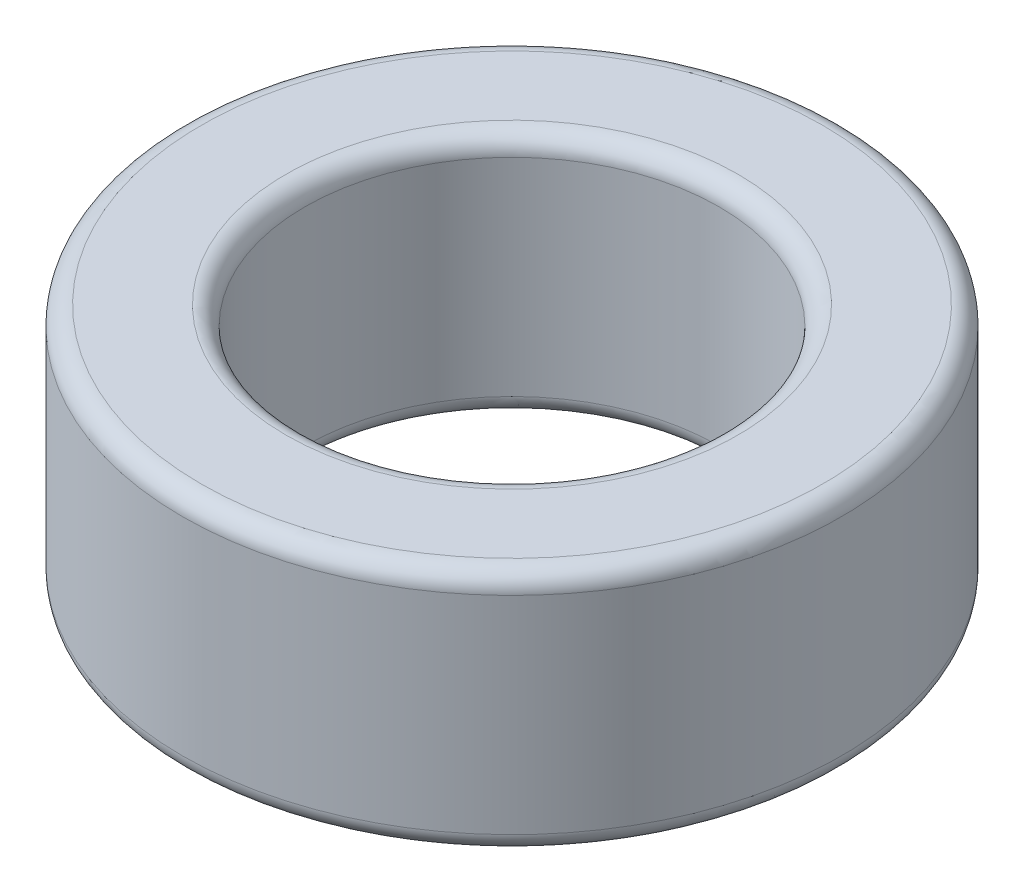
ISO-10303-21;
HEADER;
FILE_DESCRIPTION(('STEP AP214'),'2;1');
FILE_NAME('part.step','',(''),(''),'','','');
FILE_SCHEMA(('AUTOMOTIVE_DESIGN { 1 0 10303 214 1 1 1 1 }'));
ENDSEC;
DATA;
#1=APPLICATION_CONTEXT('core data for automotive mechanical design processes');
#2=APPLICATION_PROTOCOL_DEFINITION('international standard','automotive_design',2000,#1);
#3=PRODUCT_CONTEXT('',#1,'mechanical');
#4=PRODUCT('Part','Part','',(#3));
#5=PRODUCT_RELATED_PRODUCT_CATEGORY('part','',(#4));
#6=PRODUCT_DEFINITION_FORMATION('','',#4);
#7=PRODUCT_DEFINITION_CONTEXT('part definition',#1,'design');
#8=PRODUCT_DEFINITION('design','',#6,#7);
#9=PRODUCT_DEFINITION_SHAPE('','',#8);
#10=(LENGTH_UNIT() NAMED_UNIT(*) SI_UNIT(.MILLI.,.METRE.));
#11=(NAMED_UNIT(*) PLANE_ANGLE_UNIT() SI_UNIT($,.RADIAN.));
#12=(NAMED_UNIT(*) SI_UNIT($,.STERADIAN.) SOLID_ANGLE_UNIT());
#13=UNCERTAINTY_MEASURE_WITH_UNIT(LENGTH_MEASURE(1.E-05),#10,'distance_accuracy_value','');
#14=(GEOMETRIC_REPRESENTATION_CONTEXT(3) GLOBAL_UNCERTAINTY_ASSIGNED_CONTEXT((#13)) GLOBAL_UNIT_ASSIGNED_CONTEXT((#10,
#11,#12)) REPRESENTATION_CONTEXT('',''));
#15=CARTESIAN_POINT('',(0.,0.,0.));
#16=DIRECTION('',(0.,0.,1.));
#17=DIRECTION('',(1.,0.,0.));
#18=AXIS2_PLACEMENT_3D('',#15,#16,#17);
#19=CARTESIAN_POINT('',(0.,13.,0.));
#20=DIRECTION('',(0.,1.,0.));
#21=DIRECTION('',(0.,0.,1.));
#22=AXIS2_PLACEMENT_3D('',#19,#20,#21);
#23=PLANE('',#22);
#24=CARTESIAN_POINT('',(0.,13.,0.));
#25=DIRECTION('',(0.,1.,0.));
#26=DIRECTION('',(0.,0.,1.));
#27=AXIS2_PLACEMENT_3D('',#24,#25,#26);
#28=CIRCLE('',#27,12.);
#29=CARTESIAN_POINT('',(0.,13.,12.));
#30=VERTEX_POINT('',#29);
#31=EDGE_CURVE('E10',#30,#30,#28,.F.);
#32=ORIENTED_EDGE('',*,*,#31,.T.);
#33=EDGE_LOOP('',(#32));
#34=FACE_BOUND('',#33,.T.);
#35=CARTESIAN_POINT('',(0.,13.,0.));
#36=DIRECTION('',(0.,1.,0.));
#37=DIRECTION('',(0.,0.,1.));
#38=AXIS2_PLACEMENT_3D('',#35,#36,#37);
#39=CIRCLE('',#38,16.5);
#40=CARTESIAN_POINT('',(0.,13.,16.5));
#41=VERTEX_POINT('',#40);
#42=EDGE_CURVE('E38',#41,#41,#39,.T.);
#43=ORIENTED_EDGE('',*,*,#42,.T.);
#44=EDGE_LOOP('',(#43));
#45=FACE_BOUND('',#44,.T.);
#46=ADVANCED_FACE('F31',(#34,#45),#23,.T.);
#47=CARTESIAN_POINT('',(0.,0.,0.));
#48=DIRECTION('',(0.,1.,0.));
#49=DIRECTION('',(0.,0.,1.));
#50=AXIS2_PLACEMENT_3D('',#47,#48,#49);
#51=PLANE('',#50);
#52=CARTESIAN_POINT('',(0.,0.,0.));
#53=DIRECTION('',(0.,1.,0.));
#54=DIRECTION('',(0.,0.,1.));
#55=AXIS2_PLACEMENT_3D('',#52,#53,#54);
#56=CIRCLE('',#55,12.);
#57=CARTESIAN_POINT('',(0.,0.,12.));
#58=VERTEX_POINT('',#57);
#59=EDGE_CURVE('E57',#58,#58,#56,.T.);
#60=ORIENTED_EDGE('',*,*,#59,.T.);
#61=EDGE_LOOP('',(#60));
#62=FACE_BOUND('',#61,.T.);
#63=CARTESIAN_POINT('',(0.,0.,0.));
#64=DIRECTION('',(0.,1.,0.));
#65=DIRECTION('',(0.,0.,1.));
#66=AXIS2_PLACEMENT_3D('',#63,#64,#65);
#67=CIRCLE('',#66,16.5);
#68=CARTESIAN_POINT('',(0.,0.,16.5));
#69=VERTEX_POINT('',#68);
#70=EDGE_CURVE('E60',#69,#69,#67,.F.);
#71=ORIENTED_EDGE('',*,*,#70,.T.);
#72=EDGE_LOOP('',(#71));
#73=FACE_BOUND('',#72,.T.);
#74=ADVANCED_FACE('F64',(#62,#73),#51,.F.);
#75=CARTESIAN_POINT('',(0.,13.,0.));
#76=DIRECTION('',(0.,-1.,0.));
#77=DIRECTION('',(0.,0.,-1.));
#78=AXIS2_PLACEMENT_3D('',#75,#76,#77);
#79=CYLINDRICAL_SURFACE('',#78,17.5);
#80=CARTESIAN_POINT('',(0.,0.999999999999999,0.));
#81=DIRECTION('',(0.,1.,0.));
#82=DIRECTION('',(0.,0.,1.));
#83=AXIS2_PLACEMENT_3D('',#80,#81,#82);
#84=CIRCLE('',#83,17.5);
#85=CARTESIAN_POINT('',(0.,0.999999999999997,-17.5));
#86=VERTEX_POINT('',#85);
#87=EDGE_CURVE('E42',#86,#86,#84,.T.);
#88=CARTESIAN_POINT('',(0.,12.,0.));
#89=DIRECTION('',(0.,1.,0.));
#90=DIRECTION('',(0.,0.,1.));
#91=AXIS2_PLACEMENT_3D('',#88,#89,#90);
#92=CIRCLE('',#91,17.5);
#93=CARTESIAN_POINT('',(0.,12.,-17.5));
#94=VERTEX_POINT('',#93);
#95=EDGE_CURVE('E46',#94,#94,#92,.F.);
#96=CARTESIAN_POINT('',(0.,0.999999999999997,-17.5));
#97=CARTESIAN_POINT('',(0.,1.11458333333333,-17.5));
#98=CARTESIAN_POINT('',(0.,1.22916666666666,-17.5));
#99=CARTESIAN_POINT('',(0.,1.45833333333333,-17.5));
#100=CARTESIAN_POINT('',(0.,1.57291666666666,-17.5));
#101=CARTESIAN_POINT('',(0.,1.80208333333333,-17.5));
#102=CARTESIAN_POINT('',(0.,1.91666666666666,-17.5));
#103=CARTESIAN_POINT('',(0.,2.14583333333333,-17.5));
#104=CARTESIAN_POINT('',(0.,2.26041666666667,-17.5));
#105=CARTESIAN_POINT('',(0.,2.48958333333333,-17.5));
#106=CARTESIAN_POINT('',(0.,2.60416666666666,-17.5));
#107=CARTESIAN_POINT('',(0.,2.83333333333333,-17.5));
#108=CARTESIAN_POINT('',(0.,2.94791666666666,-17.5));
#109=CARTESIAN_POINT('',(0.,3.17708333333333,-17.5));
#110=CARTESIAN_POINT('',(0.,3.29166666666666,-17.5));
#111=CARTESIAN_POINT('',(0.,3.52083333333333,-17.5));
#112=CARTESIAN_POINT('',(0.,3.63541666666666,-17.5));
#113=CARTESIAN_POINT('',(0.,3.86458333333333,-17.5));
#114=CARTESIAN_POINT('',(0.,3.97916666666666,-17.5));
#115=CARTESIAN_POINT('',(0.,4.20833333333333,-17.5));
#116=CARTESIAN_POINT('',(0.,4.32291666666667,-17.5));
#117=CARTESIAN_POINT('',(0.,4.55208333333333,-17.5));
#118=CARTESIAN_POINT('',(0.,4.66666666666666,-17.5));
#119=CARTESIAN_POINT('',(0.,4.89583333333333,-17.5));
#120=CARTESIAN_POINT('',(0.,5.01041666666666,-17.5));
#121=CARTESIAN_POINT('',(0.,5.23958333333333,-17.5));
#122=CARTESIAN_POINT('',(0.,5.35416666666666,-17.5));
#123=CARTESIAN_POINT('',(0.,5.58333333333333,-17.5));
#124=CARTESIAN_POINT('',(0.,5.69791666666666,-17.5));
#125=CARTESIAN_POINT('',(0.,5.92708333333333,-17.5));
#126=CARTESIAN_POINT('',(0.,6.04166666666666,-17.5));
#127=CARTESIAN_POINT('',(0.,6.27083333333333,-17.5));
#128=CARTESIAN_POINT('',(0.,6.38541666666666,-17.5));
#129=CARTESIAN_POINT('',(0.,6.61458333333333,-17.5));
#130=CARTESIAN_POINT('',(0.,6.72916666666666,-17.5));
#131=CARTESIAN_POINT('',(0.,6.95833333333333,-17.5));
#132=CARTESIAN_POINT('',(0.,7.07291666666667,-17.5));
#133=CARTESIAN_POINT('',(0.,7.30208333333333,-17.5));
#134=CARTESIAN_POINT('',(0.,7.41666666666667,-17.5));
#135=CARTESIAN_POINT('',(0.,7.64583333333333,-17.5));
#136=CARTESIAN_POINT('',(0.,7.76041666666666,-17.5));
#137=CARTESIAN_POINT('',(0.,7.98958333333333,-17.5));
#138=CARTESIAN_POINT('',(0.,8.10416666666667,-17.5));
#139=CARTESIAN_POINT('',(0.,8.33333333333333,-17.5));
#140=CARTESIAN_POINT('',(0.,8.44791666666666,-17.5));
#141=CARTESIAN_POINT('',(0.,8.67708333333333,-17.5));
#142=CARTESIAN_POINT('',(0.,8.79166666666666,-17.5));
#143=CARTESIAN_POINT('',(0.,9.02083333333333,-17.5));
#144=CARTESIAN_POINT('',(0.,9.13541666666666,-17.5));
#145=CARTESIAN_POINT('',(0.,9.36458333333333,-17.5));
#146=CARTESIAN_POINT('',(0.,9.47916666666667,-17.5));
#147=CARTESIAN_POINT('',(0.,9.70833333333333,-17.5));
#148=CARTESIAN_POINT('',(0.,9.82291666666667,-17.5));
#149=CARTESIAN_POINT('',(0.,10.0520833333333,-17.5));
#150=CARTESIAN_POINT('',(0.,10.1666666666667,-17.5));
#151=CARTESIAN_POINT('',(0.,10.3958333333333,-17.5));
#152=CARTESIAN_POINT('',(0.,10.5104166666667,-17.5));
#153=CARTESIAN_POINT('',(0.,10.7395833333333,-17.5));
#154=CARTESIAN_POINT('',(0.,10.8541666666667,-17.5));
#155=CARTESIAN_POINT('',(0.,11.0833333333333,-17.5));
#156=CARTESIAN_POINT('',(0.,11.1979166666667,-17.5));
#157=CARTESIAN_POINT('',(0.,11.4270833333333,-17.5));
#158=CARTESIAN_POINT('',(0.,11.5416666666667,-17.5));
#159=CARTESIAN_POINT('',(0.,11.7708333333333,-17.5));
#160=CARTESIAN_POINT('',(0.,11.8854166666667,-17.5));
#161=CARTESIAN_POINT('',(0.,12.,-17.5));
#162=B_SPLINE_CURVE_WITH_KNOTS('',3,(#96,#97,#98,#99,#100,#101,#102,#103,#104,#105,#106,#107,
#108,#109,#110,#111,#112,#113,#114,#115,#116,#117,#118,#119,#120,#121,#122,#123,#124,#125,#126,
#127,#128,#129,#130,#131,#132,#133,#134,#135,#136,#137,#138,#139,#140,#141,#142,#143,#144,#145,
#146,#147,#148,#149,#150,#151,#152,#153,#154,#155,#156,#157,#158,#159,#160,#161),.UNSPECIFIED.,
.F.,.F.,(4,2,2,2,2,2,2,2,2,2,2,2,2,2,2,2,2,2,2,2,2,2,2,2,2,2,2,2,2,2,2,2,4),(0.,0.34375,
0.687500000000001,1.03125,1.375,1.71875,2.0625,2.40625,2.75,3.09375,3.4375,3.78125,4.125,
4.46875,4.8125,5.15625,5.5,5.84375,6.1875,6.53125,6.875,7.21875,7.5625,7.90625,8.25,8.59375,
8.9375,9.28125,9.625,9.96875,10.3125,10.65625,11.),.UNSPECIFIED.);
#163=EDGE_CURVE('BSEAM74',#86,#94,#162,.T.);
#164=ORIENTED_EDGE('',*,*,#87,.T.);
#165=ORIENTED_EDGE('',*,*,#95,.T.);
#166=ORIENTED_EDGE('',*,*,#163,.T.);
#167=ORIENTED_EDGE('',*,*,#163,.F.);
#168=EDGE_LOOP('',(#164,#166,#165,#167));
#169=FACE_BOUND('',#168,.T.);
#170=ADVANCED_FACE('F74',(#169),#79,.T.);
#171=CARTESIAN_POINT('',(0.,13.,0.));
#172=DIRECTION('',(0.,-1.,0.));
#173=DIRECTION('',(0.,0.,-1.));
#174=AXIS2_PLACEMENT_3D('',#171,#172,#173);
#175=CYLINDRICAL_SURFACE('',#174,11.);
#176=CARTESIAN_POINT('',(0.,0.999999999999999,0.));
#177=DIRECTION('',(0.,1.,0.));
#178=DIRECTION('',(0.,0.,1.));
#179=AXIS2_PLACEMENT_3D('',#176,#177,#178);
#180=CIRCLE('',#179,11.);
#181=CARTESIAN_POINT('',(0.,0.999999999999997,-11.));
#182=VERTEX_POINT('',#181);
#183=EDGE_CURVE('E51',#182,#182,#180,.F.);
#184=CARTESIAN_POINT('',(0.,12.,0.));
#185=DIRECTION('',(0.,1.,0.));
#186=DIRECTION('',(0.,0.,1.));
#187=AXIS2_PLACEMENT_3D('',#184,#185,#186);
#188=CIRCLE('',#187,11.);
#189=CARTESIAN_POINT('',(0.,12.,-11.));
#190=VERTEX_POINT('',#189);
#191=EDGE_CURVE('E54',#190,#190,#188,.T.);
#192=CARTESIAN_POINT('',(0.,0.999999999999997,-11.));
#193=CARTESIAN_POINT('',(0.,1.11458333333333,-11.));
#194=CARTESIAN_POINT('',(0.,1.22916666666666,-11.));
#195=CARTESIAN_POINT('',(0.,1.45833333333333,-11.));
#196=CARTESIAN_POINT('',(0.,1.57291666666666,-11.));
#197=CARTESIAN_POINT('',(0.,1.80208333333333,-11.));
#198=CARTESIAN_POINT('',(0.,1.91666666666666,-11.));
#199=CARTESIAN_POINT('',(0.,2.14583333333333,-11.));
#200=CARTESIAN_POINT('',(0.,2.26041666666667,-11.));
#201=CARTESIAN_POINT('',(0.,2.48958333333333,-11.));
#202=CARTESIAN_POINT('',(0.,2.60416666666666,-11.));
#203=CARTESIAN_POINT('',(0.,2.83333333333333,-11.));
#204=CARTESIAN_POINT('',(0.,2.94791666666666,-11.));
#205=CARTESIAN_POINT('',(0.,3.17708333333333,-11.));
#206=CARTESIAN_POINT('',(0.,3.29166666666666,-11.));
#207=CARTESIAN_POINT('',(0.,3.52083333333333,-11.));
#208=CARTESIAN_POINT('',(0.,3.63541666666666,-11.));
#209=CARTESIAN_POINT('',(0.,3.86458333333333,-11.));
#210=CARTESIAN_POINT('',(0.,3.97916666666666,-11.));
#211=CARTESIAN_POINT('',(0.,4.20833333333333,-11.));
#212=CARTESIAN_POINT('',(0.,4.32291666666667,-11.));
#213=CARTESIAN_POINT('',(0.,4.55208333333333,-11.));
#214=CARTESIAN_POINT('',(0.,4.66666666666666,-11.));
#215=CARTESIAN_POINT('',(0.,4.89583333333333,-11.));
#216=CARTESIAN_POINT('',(0.,5.01041666666666,-11.));
#217=CARTESIAN_POINT('',(0.,5.23958333333333,-11.));
#218=CARTESIAN_POINT('',(0.,5.35416666666666,-11.));
#219=CARTESIAN_POINT('',(0.,5.58333333333333,-11.));
#220=CARTESIAN_POINT('',(0.,5.69791666666666,-11.));
#221=CARTESIAN_POINT('',(0.,5.92708333333333,-11.));
#222=CARTESIAN_POINT('',(0.,6.04166666666666,-11.));
#223=CARTESIAN_POINT('',(0.,6.27083333333333,-11.));
#224=CARTESIAN_POINT('',(0.,6.38541666666666,-11.));
#225=CARTESIAN_POINT('',(0.,6.61458333333333,-11.));
#226=CARTESIAN_POINT('',(0.,6.72916666666666,-11.));
#227=CARTESIAN_POINT('',(0.,6.95833333333333,-11.));
#228=CARTESIAN_POINT('',(0.,7.07291666666667,-11.));
#229=CARTESIAN_POINT('',(0.,7.30208333333333,-11.));
#230=CARTESIAN_POINT('',(0.,7.41666666666667,-11.));
#231=CARTESIAN_POINT('',(0.,7.64583333333333,-11.));
#232=CARTESIAN_POINT('',(0.,7.76041666666666,-11.));
#233=CARTESIAN_POINT('',(0.,7.98958333333333,-11.));
#234=CARTESIAN_POINT('',(0.,8.10416666666667,-11.));
#235=CARTESIAN_POINT('',(0.,8.33333333333333,-11.));
#236=CARTESIAN_POINT('',(0.,8.44791666666666,-11.));
#237=CARTESIAN_POINT('',(0.,8.67708333333333,-11.));
#238=CARTESIAN_POINT('',(0.,8.79166666666666,-11.));
#239=CARTESIAN_POINT('',(0.,9.02083333333333,-11.));
#240=CARTESIAN_POINT('',(0.,9.13541666666666,-11.));
#241=CARTESIAN_POINT('',(0.,9.36458333333333,-11.));
#242=CARTESIAN_POINT('',(0.,9.47916666666667,-11.));
#243=CARTESIAN_POINT('',(0.,9.70833333333333,-11.));
#244=CARTESIAN_POINT('',(0.,9.82291666666667,-11.));
#245=CARTESIAN_POINT('',(0.,10.0520833333333,-11.));
#246=CARTESIAN_POINT('',(0.,10.1666666666667,-11.));
#247=CARTESIAN_POINT('',(0.,10.3958333333333,-11.));
#248=CARTESIAN_POINT('',(0.,10.5104166666667,-11.));
#249=CARTESIAN_POINT('',(0.,10.7395833333333,-11.));
#250=CARTESIAN_POINT('',(0.,10.8541666666667,-11.));
#251=CARTESIAN_POINT('',(0.,11.0833333333333,-11.));
#252=CARTESIAN_POINT('',(0.,11.1979166666667,-11.));
#253=CARTESIAN_POINT('',(0.,11.4270833333333,-11.));
#254=CARTESIAN_POINT('',(0.,11.5416666666667,-11.));
#255=CARTESIAN_POINT('',(0.,11.7708333333333,-11.));
#256=CARTESIAN_POINT('',(0.,11.8854166666667,-11.));
#257=CARTESIAN_POINT('',(0.,12.,-11.));
#258=B_SPLINE_CURVE_WITH_KNOTS('',3,(#192,#193,#194,#195,#196,#197,#198,#199,#200,#201,#202,
#203,#204,#205,#206,#207,#208,#209,#210,#211,#212,#213,#214,#215,#216,#217,#218,#219,#220,#221,
#222,#223,#224,#225,#226,#227,#228,#229,#230,#231,#232,#233,#234,#235,#236,#237,#238,#239,#240,
#241,#242,#243,#244,#245,#246,#247,#248,#249,#250,#251,#252,#253,#254,#255,#256,#257),
.UNSPECIFIED.,.F.,.F.,(4,2,2,2,2,2,2,2,2,2,2,2,2,2,2,2,2,2,2,2,2,2,2,2,2,2,2,2,2,2,2,2,4),(0.,
0.34375,0.687500000000001,1.03125,1.375,1.71875,2.0625,2.40625,2.75,3.09375,3.4375,3.78125,
4.125,4.46875,4.8125,5.15625,5.5,5.84375,6.1875,6.53125,6.875,7.21875,7.5625,7.90625,8.25,
8.59375,8.9375,9.28125,9.625,9.96875,10.3125,10.65625,11.),.UNSPECIFIED.);
#259=EDGE_CURVE('BSEAM77',#182,#190,#258,.T.);
#260=ORIENTED_EDGE('',*,*,#183,.T.);
#261=ORIENTED_EDGE('',*,*,#191,.T.);
#262=ORIENTED_EDGE('',*,*,#259,.T.);
#263=ORIENTED_EDGE('',*,*,#259,.F.);
#264=EDGE_LOOP('',(#260,#262,#261,#263));
#265=FACE_BOUND('',#264,.T.);
#266=ADVANCED_FACE('F77',(#265),#175,.F.);
#267=CARTESIAN_POINT('',(0.,0.999999999999999,0.));
#268=DIRECTION('',(0.,1.,0.));
#269=DIRECTION('',(0.,0.,1.));
#270=AXIS2_PLACEMENT_3D('',#267,#268,#269);
#271=TOROIDAL_SURFACE('',#270,12.,1.);
#272=ORIENTED_EDGE('',*,*,#183,.F.);
#273=EDGE_LOOP('',(#272));
#274=FACE_BOUND('',#273,.T.);
#275=ORIENTED_EDGE('',*,*,#59,.F.);
#276=EDGE_LOOP('',(#275));
#277=FACE_BOUND('',#276,.T.);
#278=ADVANCED_FACE('F70',(#274,#277),#271,.T.);
#279=CARTESIAN_POINT('',(0.,0.999999999999999,0.));
#280=DIRECTION('',(0.,1.,0.));
#281=DIRECTION('',(0.,0.,1.));
#282=AXIS2_PLACEMENT_3D('',#279,#280,#281);
#283=TOROIDAL_SURFACE('',#282,16.5,1.);
#284=ORIENTED_EDGE('',*,*,#70,.F.);
#285=EDGE_LOOP('',(#284));
#286=FACE_BOUND('',#285,.T.);
#287=ORIENTED_EDGE('',*,*,#87,.F.);
#288=EDGE_LOOP('',(#287));
#289=FACE_BOUND('',#288,.T.);
#290=ADVANCED_FACE('F66',(#286,#289),#283,.T.);
#291=CARTESIAN_POINT('',(0.,12.,0.));
#292=DIRECTION('',(0.,1.,0.));
#293=DIRECTION('',(0.,0.,1.));
#294=AXIS2_PLACEMENT_3D('',#291,#292,#293);
#295=TOROIDAL_SURFACE('',#294,12.,1.);
#296=ORIENTED_EDGE('',*,*,#31,.F.);
#297=EDGE_LOOP('',(#296));
#298=FACE_BOUND('',#297,.T.);
#299=ORIENTED_EDGE('',*,*,#191,.F.);
#300=EDGE_LOOP('',(#299));
#301=FACE_BOUND('',#300,.T.);
#302=ADVANCED_FACE('F69',(#298,#301),#295,.T.);
#303=CARTESIAN_POINT('',(0.,12.,0.));
#304=DIRECTION('',(0.,1.,0.));
#305=DIRECTION('',(0.,0.,1.));
#306=AXIS2_PLACEMENT_3D('',#303,#304,#305);
#307=TOROIDAL_SURFACE('',#306,16.5,1.);
#308=ORIENTED_EDGE('',*,*,#95,.F.);
#309=EDGE_LOOP('',(#308));
#310=FACE_BOUND('',#309,.T.);
#311=ORIENTED_EDGE('',*,*,#42,.F.);
#312=EDGE_LOOP('',(#311));
#313=FACE_BOUND('',#312,.T.);
#314=ADVANCED_FACE('F33',(#310,#313),#307,.T.);
#315=CLOSED_SHELL('',(#46,#74,#170,#266,#278,#290,#302,#314));
#316=MANIFOLD_SOLID_BREP('B2',#315);
#317=ADVANCED_BREP_SHAPE_REPRESENTATION('',(#18,#316),#14);
#318=SHAPE_DEFINITION_REPRESENTATION(#9,#317);
ENDSEC;
END-ISO-10303-21;
